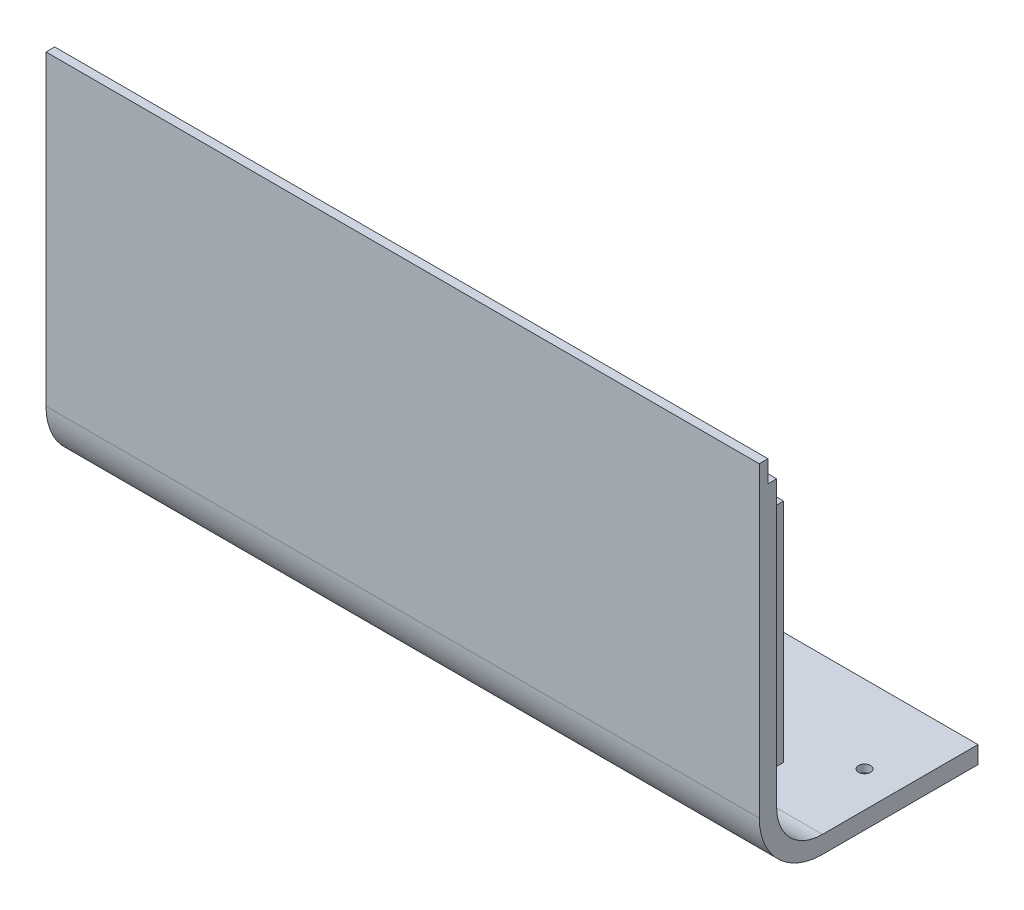
ISO-10303-21;
HEADER;
FILE_DESCRIPTION(('STEP AP214'),'2;1');
FILE_NAME('part.step','',(''),(''),'','','');
FILE_SCHEMA(('AUTOMOTIVE_DESIGN { 1 0 10303 214 1 1 1 1 }'));
ENDSEC;
DATA;
#1=APPLICATION_CONTEXT('core data for automotive mechanical design processes');
#2=APPLICATION_PROTOCOL_DEFINITION('international standard','automotive_design',2000,#1);
#3=PRODUCT_CONTEXT('',#1,'mechanical');
#4=PRODUCT('Part','Part','',(#3));
#5=PRODUCT_RELATED_PRODUCT_CATEGORY('part','',(#4));
#6=PRODUCT_DEFINITION_FORMATION('','',#4);
#7=PRODUCT_DEFINITION_CONTEXT('part definition',#1,'design');
#8=PRODUCT_DEFINITION('design','',#6,#7);
#9=PRODUCT_DEFINITION_SHAPE('','',#8);
#10=(LENGTH_UNIT() NAMED_UNIT(*) SI_UNIT(.MILLI.,.METRE.));
#11=(NAMED_UNIT(*) PLANE_ANGLE_UNIT() SI_UNIT($,.RADIAN.));
#12=(NAMED_UNIT(*) SI_UNIT($,.STERADIAN.) SOLID_ANGLE_UNIT());
#13=UNCERTAINTY_MEASURE_WITH_UNIT(LENGTH_MEASURE(1.E-05),#10,'distance_accuracy_value','');
#14=(GEOMETRIC_REPRESENTATION_CONTEXT(3) GLOBAL_UNCERTAINTY_ASSIGNED_CONTEXT((#13)) GLOBAL_UNIT_ASSIGNED_CONTEXT((#10,
#11,#12)) REPRESENTATION_CONTEXT('',''));
#15=CARTESIAN_POINT('',(0.,0.,0.));
#16=DIRECTION('',(0.,0.,1.));
#17=DIRECTION('',(1.,0.,0.));
#18=AXIS2_PLACEMENT_3D('',#15,#16,#17);
#19=CARTESIAN_POINT('',(131.1,8.40000000000006,0.));
#20=DIRECTION('',(0.,0.,1.));
#21=DIRECTION('',(1.,0.,0.));
#22=AXIS2_PLACEMENT_3D('',#19,#20,#21);
#23=PLANE('',#22);
#24=DIRECTION('',(0.,-1.,0.));
#25=VECTOR('',#24,1.);
#26=CARTESIAN_POINT('',(5.00000000000001,53.5000000000001,0.));
#27=LINE('',#26,#25);
#28=CARTESIAN_POINT('',(5.00000000000001,53.5000000000001,0.));
#29=VERTEX_POINT('',#28);
#30=CARTESIAN_POINT('',(5.,11.9000000000001,0.));
#31=VERTEX_POINT('',#30);
#32=EDGE_CURVE('E224',#29,#31,#27,.T.);
#33=ORIENTED_EDGE('',*,*,#32,.F.);
#34=DIRECTION('',(1.,0.,0.));
#35=VECTOR('',#34,1.);
#36=CARTESIAN_POINT('',(5.00000000000001,53.5000000000001,0.));
#37=LINE('',#36,#35);
#38=CARTESIAN_POINT('',(3.14,53.5000000000001,0.));
#39=VERTEX_POINT('',#38);
#40=EDGE_CURVE('E240',#39,#29,#37,.T.);
#41=ORIENTED_EDGE('',*,*,#40,.F.);
#42=DIRECTION('',(0.,1.,0.));
#43=VECTOR('',#42,1.);
#44=CARTESIAN_POINT('',(3.14000000000001,53.5000000000001,0.));
#45=LINE('',#44,#43);
#46=CARTESIAN_POINT('',(3.14,11.9000000000001,0.));
#47=VERTEX_POINT('',#46);
#48=EDGE_CURVE('E232',#47,#39,#45,.T.);
#49=ORIENTED_EDGE('',*,*,#48,.F.);
#50=DIRECTION('',(-1.,0.,0.));
#51=VECTOR('',#50,1.);
#52=CARTESIAN_POINT('',(5.00000000000001,11.9000000000001,0.));
#53=LINE('',#52,#51);
#54=EDGE_CURVE('E60',#31,#47,#53,.T.);
#55=ORIENTED_EDGE('',*,*,#54,.F.);
#56=EDGE_LOOP('',(#33,#41,#49,#55));
#57=FACE_BOUND('',#56,.T.);
#58=DIRECTION('',(0.,1.,0.));
#59=VECTOR('',#58,1.);
#60=CARTESIAN_POINT('',(126.1,53.5000000000001,0.));
#61=LINE('',#60,#59);
#62=CARTESIAN_POINT('',(126.1,11.9000000000001,0.));
#63=VERTEX_POINT('',#62);
#64=CARTESIAN_POINT('',(126.1,53.5000000000001,0.));
#65=VERTEX_POINT('',#64);
#66=EDGE_CURVE('E254',#63,#65,#61,.T.);
#67=ORIENTED_EDGE('',*,*,#66,.F.);
#68=DIRECTION('',(-1.,0.,0.));
#69=VECTOR('',#68,1.);
#70=CARTESIAN_POINT('',(126.1,11.9000000000001,0.));
#71=LINE('',#70,#69);
#72=CARTESIAN_POINT('',(127.96,11.9000000000001,0.));
#73=VERTEX_POINT('',#72);
#74=EDGE_CURVE('E259',#73,#63,#71,.T.);
#75=ORIENTED_EDGE('',*,*,#74,.F.);
#76=DIRECTION('',(0.,-1.,0.));
#77=VECTOR('',#76,1.);
#78=CARTESIAN_POINT('',(127.96,53.5000000000001,0.));
#79=LINE('',#78,#77);
#80=CARTESIAN_POINT('',(127.96,53.5000000000001,0.));
#81=VERTEX_POINT('',#80);
#82=EDGE_CURVE('E271',#81,#73,#79,.T.);
#83=ORIENTED_EDGE('',*,*,#82,.F.);
#84=DIRECTION('',(1.,0.,0.));
#85=VECTOR('',#84,1.);
#86=CARTESIAN_POINT('',(126.1,53.5000000000001,0.));
#87=LINE('',#86,#85);
#88=EDGE_CURVE('E268',#65,#81,#87,.T.);
#89=ORIENTED_EDGE('',*,*,#88,.F.);
#90=EDGE_LOOP('',(#67,#75,#83,#89));
#91=FACE_BOUND('',#90,.T.);
#92=DIRECTION('',(-1.,0.,0.));
#93=VECTOR('',#92,1.);
#94=CARTESIAN_POINT('',(131.1,60.8,0.));
#95=LINE('',#94,#93);
#96=CARTESIAN_POINT('',(131.1,60.8,0.));
#97=VERTEX_POINT('',#96);
#98=CARTESIAN_POINT('',(0.,60.8,0.));
#99=VERTEX_POINT('',#98);
#100=EDGE_CURVE('E309',#97,#99,#95,.T.);
#101=ORIENTED_EDGE('',*,*,#100,.F.);
#102=DIRECTION('',(0.,1.,0.));
#103=VECTOR('',#102,1.);
#104=CARTESIAN_POINT('',(131.1,8.40000000000006,0.));
#105=LINE('',#104,#103);
#106=CARTESIAN_POINT('',(131.1,8.40000000000006,0.));
#107=VERTEX_POINT('',#106);
#108=EDGE_CURVE('E190',#107,#97,#105,.T.);
#109=ORIENTED_EDGE('',*,*,#108,.F.);
#110=DIRECTION('',(-1.,0.,0.));
#111=VECTOR('',#110,1.);
#112=CARTESIAN_POINT('',(131.1,8.40000000000006,0.));
#113=LINE('',#112,#111);
#114=CARTESIAN_POINT('',(0.,8.40000000000006,0.));
#115=VERTEX_POINT('',#114);
#116=EDGE_CURVE('E203',#107,#115,#113,.T.);
#117=ORIENTED_EDGE('',*,*,#116,.T.);
#118=DIRECTION('',(0.,1.,0.));
#119=VECTOR('',#118,1.);
#120=CARTESIAN_POINT('',(0.,8.40000000000006,0.));
#121=LINE('',#120,#119);
#122=EDGE_CURVE('E200',#115,#99,#121,.T.);
#123=ORIENTED_EDGE('',*,*,#122,.T.);
#124=EDGE_LOOP('',(#101,#109,#117,#123));
#125=FACE_BOUND('',#124,.T.);
#126=ADVANCED_FACE('F37',(#57,#91,#125),#23,.F.);
#127=CARTESIAN_POINT('',(131.1,239.6,3.2));
#128=DIRECTION('',(0.,0.,-1.));
#129=DIRECTION('',(0.,1.,0.));
#130=AXIS2_PLACEMENT_3D('',#127,#128,#129);
#131=PLANE('',#130);
#132=DIRECTION('',(1.,0.,0.));
#133=VECTOR('',#132,1.);
#134=CARTESIAN_POINT('',(0.,64.8,3.19999999999998));
#135=LINE('',#134,#133);
#136=CARTESIAN_POINT('',(0.,64.8,3.19999999999998));
#137=VERTEX_POINT('',#136);
#138=CARTESIAN_POINT('',(131.1,64.8,3.19999999999998));
#139=VERTEX_POINT('',#138);
#140=EDGE_CURVE('E162',#137,#139,#135,.T.);
#141=ORIENTED_EDGE('',*,*,#140,.F.);
#142=DIRECTION('',(0.,-1.,0.));
#143=VECTOR('',#142,1.);
#144=CARTESIAN_POINT('',(0.,239.6,3.2));
#145=LINE('',#144,#143);
#146=CARTESIAN_POINT('',(0.,8.40000000000008,3.19999999999998));
#147=VERTEX_POINT('',#146);
#148=EDGE_CURVE('E173',#137,#147,#145,.T.);
#149=ORIENTED_EDGE('',*,*,#148,.T.);
#150=DIRECTION('',(-1.,0.,0.));
#151=VECTOR('',#150,1.);
#152=CARTESIAN_POINT('',(131.1,8.40000000000008,3.19999999999998));
#153=LINE('',#152,#151);
#154=CARTESIAN_POINT('',(131.1,8.40000000000008,3.19999999999998));
#155=VERTEX_POINT('',#154);
#156=EDGE_CURVE('E45',#155,#147,#153,.T.);
#157=ORIENTED_EDGE('',*,*,#156,.F.);
#158=DIRECTION('',(0.,-1.,0.));
#159=VECTOR('',#158,1.);
#160=CARTESIAN_POINT('',(131.1,239.6,3.2));
#161=LINE('',#160,#159);
#162=EDGE_CURVE('E175',#139,#155,#161,.T.);
#163=ORIENTED_EDGE('',*,*,#162,.F.);
#164=EDGE_LOOP('',(#141,#149,#157,#163));
#165=FACE_BOUND('',#164,.T.);
#166=ADVANCED_FACE('F39',(#165),#131,.F.);
#167=CARTESIAN_POINT('',(131.1,239.6,-8.4));
#168=DIRECTION('',(1.,0.,0.));
#169=DIRECTION('',(0.,0.,-1.));
#170=AXIS2_PLACEMENT_3D('',#167,#168,#169);
#171=PLANE('',#170);
#172=ORIENTED_EDGE('',*,*,#108,.T.);
#173=DIRECTION('',(0.,0.,1.));
#174=VECTOR('',#173,1.);
#175=CARTESIAN_POINT('',(131.1,60.8,0.));
#176=LINE('',#175,#174);
#177=CARTESIAN_POINT('',(131.1,60.8,1.6));
#178=VERTEX_POINT('',#177);
#179=EDGE_CURVE('E168',#97,#178,#176,.T.);
#180=ORIENTED_EDGE('',*,*,#179,.T.);
#181=DIRECTION('',(0.,1.,0.));
#182=VECTOR('',#181,1.);
#183=CARTESIAN_POINT('',(131.1,0.,1.6));
#184=LINE('',#183,#182);
#185=CARTESIAN_POINT('',(131.1,64.8,1.6));
#186=VERTEX_POINT('',#185);
#187=EDGE_CURVE('E423',#178,#186,#184,.T.);
#188=ORIENTED_EDGE('',*,*,#187,.T.);
#189=DIRECTION('',(0.,0.,1.));
#190=VECTOR('',#189,1.);
#191=CARTESIAN_POINT('',(131.1,64.8,0.));
#192=LINE('',#191,#190);
#193=EDGE_CURVE('E421',#186,#139,#192,.T.);
#194=ORIENTED_EDGE('',*,*,#193,.T.);
#195=ORIENTED_EDGE('',*,*,#162,.T.);
#196=CARTESIAN_POINT('',(131.1,8.4,-8.40000000000002));
#197=DIRECTION('',(1.,0.,0.));
#198=DIRECTION('',(0.,0.,-1.));
#199=AXIS2_PLACEMENT_3D('',#196,#197,#198);
#200=CIRCLE('',#199,11.6);
#201=CARTESIAN_POINT('',(131.1,-3.2,-8.40000000000011));
#202=VERTEX_POINT('',#201);
#203=EDGE_CURVE('E290',#155,#202,#200,.T.);
#204=ORIENTED_EDGE('',*,*,#203,.T.);
#205=DIRECTION('',(0.,0.,-1.));
#206=VECTOR('',#205,1.);
#207=CARTESIAN_POINT('',(131.1,-3.2,-37.));
#208=LINE('',#207,#206);
#209=CARTESIAN_POINT('',(131.1,-3.2,-37.));
#210=VERTEX_POINT('',#209);
#211=EDGE_CURVE('E292',#202,#210,#208,.T.);
#212=ORIENTED_EDGE('',*,*,#211,.T.);
#213=DIRECTION('',(0.,1.,0.));
#214=VECTOR('',#213,1.);
#215=CARTESIAN_POINT('',(131.1,0.,-37.));
#216=LINE('',#215,#214);
#217=CARTESIAN_POINT('',(131.1,0.,-37.));
#218=VERTEX_POINT('',#217);
#219=EDGE_CURVE('E294',#210,#218,#216,.T.);
#220=ORIENTED_EDGE('',*,*,#219,.T.);
#221=DIRECTION('',(0.,0.,1.));
#222=VECTOR('',#221,1.);
#223=CARTESIAN_POINT('',(131.1,0.,-8.40000000000006));
#224=LINE('',#223,#222);
#225=CARTESIAN_POINT('',(131.1,0.,-8.40000000000006));
#226=VERTEX_POINT('',#225);
#227=EDGE_CURVE('E296',#218,#226,#224,.T.);
#228=ORIENTED_EDGE('',*,*,#227,.T.);
#229=CARTESIAN_POINT('',(131.1,8.4,-8.4));
#230=DIRECTION('',(-1.,0.,0.));
#231=DIRECTION('',(0.,0.,-1.));
#232=AXIS2_PLACEMENT_3D('',#229,#230,#231);
#233=CIRCLE('',#232,8.4);
#234=EDGE_CURVE('E297',#226,#107,#233,.T.);
#235=ORIENTED_EDGE('',*,*,#234,.T.);
#236=EDGE_LOOP('',(#172,#180,#188,#194,#195,#204,#212,#220,#228,#235));
#237=FACE_BOUND('',#236,.T.);
#238=ADVANCED_FACE('F304',(#237),#171,.T.);
#239=CARTESIAN_POINT('',(0.,239.6,-8.4));
#240=DIRECTION('',(1.,0.,0.));
#241=DIRECTION('',(0.,0.,-1.));
#242=AXIS2_PLACEMENT_3D('',#239,#240,#241);
#243=PLANE('',#242);
#244=DIRECTION('',(0.,0.,1.));
#245=VECTOR('',#244,1.);
#246=CARTESIAN_POINT('',(0.,60.8,-8.39999999999997));
#247=LINE('',#246,#245);
#248=CARTESIAN_POINT('',(0.,60.8,1.6));
#249=VERTEX_POINT('',#248);
#250=EDGE_CURVE('E11',#99,#249,#247,.T.);
#251=ORIENTED_EDGE('',*,*,#250,.F.);
#252=ORIENTED_EDGE('',*,*,#122,.F.);
#253=CARTESIAN_POINT('',(0.,8.4,-8.4));
#254=DIRECTION('',(-1.,0.,0.));
#255=DIRECTION('',(0.,0.,-1.));
#256=AXIS2_PLACEMENT_3D('',#253,#254,#255);
#257=CIRCLE('',#256,8.4);
#258=CARTESIAN_POINT('',(0.,0.,-8.40000000000006));
#259=VERTEX_POINT('',#258);
#260=EDGE_CURVE('E198',#259,#115,#257,.T.);
#261=ORIENTED_EDGE('',*,*,#260,.F.);
#262=DIRECTION('',(0.,0.,1.));
#263=VECTOR('',#262,1.);
#264=CARTESIAN_POINT('',(0.,0.,-8.40000000000006));
#265=LINE('',#264,#263);
#266=CARTESIAN_POINT('',(0.,0.,-37.));
#267=VERTEX_POINT('',#266);
#268=EDGE_CURVE('E196',#267,#259,#265,.T.);
#269=ORIENTED_EDGE('',*,*,#268,.F.);
#270=DIRECTION('',(0.,1.,0.));
#271=VECTOR('',#270,1.);
#272=CARTESIAN_POINT('',(0.,0.,-37.));
#273=LINE('',#272,#271);
#274=CARTESIAN_POINT('',(0.,-3.2,-37.));
#275=VERTEX_POINT('',#274);
#276=EDGE_CURVE('E194',#275,#267,#273,.T.);
#277=ORIENTED_EDGE('',*,*,#276,.F.);
#278=DIRECTION('',(0.,0.,-1.));
#279=VECTOR('',#278,1.);
#280=CARTESIAN_POINT('',(0.,-3.2,-37.));
#281=LINE('',#280,#279);
#282=CARTESIAN_POINT('',(0.,-3.2,-8.40000000000011));
#283=VERTEX_POINT('',#282);
#284=EDGE_CURVE('E184',#283,#275,#281,.T.);
#285=ORIENTED_EDGE('',*,*,#284,.F.);
#286=CARTESIAN_POINT('',(0.,8.4,-8.40000000000002));
#287=DIRECTION('',(1.,0.,0.));
#288=DIRECTION('',(0.,0.,-1.));
#289=AXIS2_PLACEMENT_3D('',#286,#287,#288);
#290=CIRCLE('',#289,11.6);
#291=EDGE_CURVE('E181',#147,#283,#290,.T.);
#292=ORIENTED_EDGE('',*,*,#291,.F.);
#293=ORIENTED_EDGE('',*,*,#148,.F.);
#294=DIRECTION('',(0.,0.,1.));
#295=VECTOR('',#294,1.);
#296=CARTESIAN_POINT('',(0.,64.8,0.));
#297=LINE('',#296,#295);
#298=CARTESIAN_POINT('',(0.,64.8,1.6));
#299=VERTEX_POINT('',#298);
#300=EDGE_CURVE('E159',#299,#137,#297,.T.);
#301=ORIENTED_EDGE('',*,*,#300,.F.);
#302=DIRECTION('',(0.,1.,0.));
#303=VECTOR('',#302,1.);
#304=CARTESIAN_POINT('',(0.,0.,1.6));
#305=LINE('',#304,#303);
#306=EDGE_CURVE('E167',#249,#299,#305,.T.);
#307=ORIENTED_EDGE('',*,*,#306,.F.);
#308=EDGE_LOOP('',(#251,#252,#261,#269,#277,#285,#292,#293,#301,#307));
#309=FACE_BOUND('',#308,.T.);
#310=ADVANCED_FACE('F179',(#309),#243,.F.);
#311=CARTESIAN_POINT('',(124.55,-3.19999999999998,-22.6999999999995));
#312=DIRECTION('',(0.,1.,0.));
#313=DIRECTION('',(0.,0.,1.));
#314=AXIS2_PLACEMENT_3D('',#311,#312,#313);
#315=CYLINDRICAL_SURFACE('',#314,1.10000000000002);
#316=CARTESIAN_POINT('',(124.55,0.,-22.6999999999995));
#317=DIRECTION('',(0.,-1.,0.));
#318=DIRECTION('',(0.,0.,-1.));
#319=AXIS2_PLACEMENT_3D('',#316,#317,#318);
#320=CIRCLE('',#319,1.10000000000002);
#321=CARTESIAN_POINT('',(124.55,0.,-23.7999999999995));
#322=VERTEX_POINT('',#321);
#323=EDGE_CURVE('E187',#322,#322,#320,.T.);
#324=ORIENTED_EDGE('',*,*,#323,.F.);
#325=EDGE_LOOP('',(#324));
#326=FACE_BOUND('',#325,.T.);
#327=CARTESIAN_POINT('',(124.55,-1.4,-22.6999999999995));
#328=DIRECTION('',(0.,-1.,0.));
#329=DIRECTION('',(0.,0.,-1.));
#330=AXIS2_PLACEMENT_3D('',#327,#328,#329);
#331=CIRCLE('',#330,1.10000000000002);
#332=CARTESIAN_POINT('',(124.55,-1.4,-23.7999999999995));
#333=VERTEX_POINT('',#332);
#334=EDGE_CURVE('E221',#333,#333,#331,.F.);
#335=ORIENTED_EDGE('',*,*,#334,.F.);
#336=EDGE_LOOP('',(#335));
#337=FACE_BOUND('',#336,.T.);
#338=ADVANCED_FACE('F381',(#326,#337),#315,.F.);
#339=CARTESIAN_POINT('',(6.55,-3.19999999999998,-22.6999999999995));
#340=DIRECTION('',(0.,1.,0.));
#341=DIRECTION('',(0.,0.,1.));
#342=AXIS2_PLACEMENT_3D('',#339,#340,#341);
#343=CYLINDRICAL_SURFACE('',#342,1.1);
#344=CARTESIAN_POINT('',(6.55,0.,-22.6999999999995));
#345=DIRECTION('',(0.,-1.,0.));
#346=DIRECTION('',(0.,0.,-1.));
#347=AXIS2_PLACEMENT_3D('',#344,#345,#346);
#348=CIRCLE('',#347,1.1);
#349=CARTESIAN_POINT('',(6.55,0.,-23.7999999999995));
#350=VERTEX_POINT('',#349);
#351=EDGE_CURVE('E182',#350,#350,#348,.T.);
#352=ORIENTED_EDGE('',*,*,#351,.F.);
#353=EDGE_LOOP('',(#352));
#354=FACE_BOUND('',#353,.T.);
#355=CARTESIAN_POINT('',(6.55,-1.4,-22.6999999999995));
#356=DIRECTION('',(0.,-1.,0.));
#357=DIRECTION('',(0.,0.,-1.));
#358=AXIS2_PLACEMENT_3D('',#355,#356,#357);
#359=CIRCLE('',#358,1.1);
#360=CARTESIAN_POINT('',(6.55,-1.4,-23.7999999999995));
#361=VERTEX_POINT('',#360);
#362=EDGE_CURVE('E219',#361,#361,#359,.F.);
#363=ORIENTED_EDGE('',*,*,#362,.F.);
#364=EDGE_LOOP('',(#363));
#365=FACE_BOUND('',#364,.T.);
#366=ADVANCED_FACE('F377',(#354,#365),#343,.F.);
#367=CARTESIAN_POINT('',(131.1,8.4,-8.40000000000002));
#368=DIRECTION('',(-1.,0.,0.));
#369=DIRECTION('',(0.,0.,1.));
#370=AXIS2_PLACEMENT_3D('',#367,#368,#369);
#371=CYLINDRICAL_SURFACE('',#370,11.6);
#372=ORIENTED_EDGE('',*,*,#291,.T.);
#373=DIRECTION('',(-1.,0.,0.));
#374=VECTOR('',#373,1.);
#375=CARTESIAN_POINT('',(131.1,-3.2,-8.40000000000011));
#376=LINE('',#375,#374);
#377=EDGE_CURVE('E215',#202,#283,#376,.T.);
#378=ORIENTED_EDGE('',*,*,#377,.F.);
#379=ORIENTED_EDGE('',*,*,#203,.F.);
#380=ORIENTED_EDGE('',*,*,#156,.T.);
#381=EDGE_LOOP('',(#372,#378,#379,#380));
#382=FACE_BOUND('',#381,.T.);
#383=ADVANCED_FACE('F380',(#382),#371,.T.);
#384=CARTESIAN_POINT('',(131.1,-3.2,-37.));
#385=DIRECTION('',(0.,1.,0.));
#386=DIRECTION('',(0.,0.,1.));
#387=AXIS2_PLACEMENT_3D('',#384,#385,#386);
#388=PLANE('',#387);
#389=CARTESIAN_POINT('',(124.55,-3.2,-22.7000000000002));
#390=DIRECTION('',(0.,-1.,0.));
#391=DIRECTION('',(0.,0.,-1.));
#392=AXIS2_PLACEMENT_3D('',#389,#390,#391);
#393=CIRCLE('',#392,2.27);
#394=CARTESIAN_POINT('',(124.55,-3.2,-24.9700000000002));
#395=VERTEX_POINT('',#394);
#396=EDGE_CURVE('E322',#395,#395,#393,.T.);
#397=ORIENTED_EDGE('',*,*,#396,.F.);
#398=EDGE_LOOP('',(#397));
#399=FACE_BOUND('',#398,.T.);
#400=CARTESIAN_POINT('',(6.55,-3.2,-22.7000000000003));
#401=DIRECTION('',(0.,-1.,0.));
#402=DIRECTION('',(0.,0.,-1.));
#403=AXIS2_PLACEMENT_3D('',#400,#401,#402);
#404=CIRCLE('',#403,2.27);
#405=CARTESIAN_POINT('',(6.55,-3.2,-24.9700000000003));
#406=VERTEX_POINT('',#405);
#407=EDGE_CURVE('E311',#406,#406,#404,.T.);
#408=ORIENTED_EDGE('',*,*,#407,.F.);
#409=EDGE_LOOP('',(#408));
#410=FACE_BOUND('',#409,.T.);
#411=ORIENTED_EDGE('',*,*,#284,.T.);
#412=DIRECTION('',(-1.,0.,0.));
#413=VECTOR('',#412,1.);
#414=CARTESIAN_POINT('',(131.1,-3.2,-37.));
#415=LINE('',#414,#413);
#416=EDGE_CURVE('E212',#210,#275,#415,.T.);
#417=ORIENTED_EDGE('',*,*,#416,.F.);
#418=ORIENTED_EDGE('',*,*,#211,.F.);
#419=ORIENTED_EDGE('',*,*,#377,.T.);
#420=EDGE_LOOP('',(#411,#417,#418,#419));
#421=FACE_BOUND('',#420,.T.);
#422=ADVANCED_FACE('F400',(#399,#410,#421),#388,.F.);
#423=CARTESIAN_POINT('',(131.1,0.,-37.));
#424=DIRECTION('',(0.,0.,1.));
#425=DIRECTION('',(1.,0.,0.));
#426=AXIS2_PLACEMENT_3D('',#423,#424,#425);
#427=PLANE('',#426);
#428=ORIENTED_EDGE('',*,*,#276,.T.);
#429=DIRECTION('',(-1.,0.,0.));
#430=VECTOR('',#429,1.);
#431=CARTESIAN_POINT('',(131.1,0.,-37.));
#432=LINE('',#431,#430);
#433=EDGE_CURVE('E209',#218,#267,#432,.T.);
#434=ORIENTED_EDGE('',*,*,#433,.F.);
#435=ORIENTED_EDGE('',*,*,#219,.F.);
#436=ORIENTED_EDGE('',*,*,#416,.T.);
#437=EDGE_LOOP('',(#428,#434,#435,#436));
#438=FACE_BOUND('',#437,.T.);
#439=ADVANCED_FACE('F396',(#438),#427,.F.);
#440=CARTESIAN_POINT('',(131.1,0.,-8.40000000000006));
#441=DIRECTION('',(0.,-1.,0.));
#442=DIRECTION('',(0.,0.,-1.));
#443=AXIS2_PLACEMENT_3D('',#440,#441,#442);
#444=PLANE('',#443);
#445=ORIENTED_EDGE('',*,*,#351,.T.);
#446=EDGE_LOOP('',(#445));
#447=FACE_BOUND('',#446,.T.);
#448=ORIENTED_EDGE('',*,*,#323,.T.);
#449=EDGE_LOOP('',(#448));
#450=FACE_BOUND('',#449,.T.);
#451=ORIENTED_EDGE('',*,*,#268,.T.);
#452=DIRECTION('',(-1.,0.,0.));
#453=VECTOR('',#452,1.);
#454=CARTESIAN_POINT('',(131.1,0.,-8.40000000000006));
#455=LINE('',#454,#453);
#456=EDGE_CURVE('E206',#226,#259,#455,.T.);
#457=ORIENTED_EDGE('',*,*,#456,.F.);
#458=ORIENTED_EDGE('',*,*,#227,.F.);
#459=ORIENTED_EDGE('',*,*,#433,.T.);
#460=EDGE_LOOP('',(#451,#457,#458,#459));
#461=FACE_BOUND('',#460,.T.);
#462=ADVANCED_FACE('F392',(#447,#450,#461),#444,.F.);
#463=CARTESIAN_POINT('',(131.1,8.4,-8.4));
#464=DIRECTION('',(-1.,0.,0.));
#465=DIRECTION('',(0.,0.,1.));
#466=AXIS2_PLACEMENT_3D('',#463,#464,#465);
#467=CYLINDRICAL_SURFACE('',#466,8.4);
#468=ORIENTED_EDGE('',*,*,#260,.T.);
#469=ORIENTED_EDGE('',*,*,#116,.F.);
#470=ORIENTED_EDGE('',*,*,#234,.F.);
#471=ORIENTED_EDGE('',*,*,#456,.T.);
#472=EDGE_LOOP('',(#468,#469,#470,#471));
#473=FACE_BOUND('',#472,.T.);
#474=ADVANCED_FACE('F373',(#473),#467,.F.);
#475=CARTESIAN_POINT('',(126.1,53.5000000000001,-4.4));
#476=DIRECTION('',(1.,0.,0.));
#477=DIRECTION('',(0.,0.,-1.));
#478=AXIS2_PLACEMENT_3D('',#475,#476,#477);
#479=PLANE('',#478);
#480=ORIENTED_EDGE('',*,*,#66,.T.);
#481=DIRECTION('',(0.,0.,1.));
#482=VECTOR('',#481,1.);
#483=CARTESIAN_POINT('',(126.1,53.5000000000001,-4.4));
#484=LINE('',#483,#482);
#485=CARTESIAN_POINT('',(126.1,53.5000000000001,-4.4));
#486=VERTEX_POINT('',#485);
#487=EDGE_CURVE('E284',#486,#65,#484,.T.);
#488=ORIENTED_EDGE('',*,*,#487,.F.);
#489=DIRECTION('',(0.,1.,0.));
#490=VECTOR('',#489,1.);
#491=CARTESIAN_POINT('',(126.1,53.5000000000001,-4.4));
#492=LINE('',#491,#490);
#493=CARTESIAN_POINT('',(126.1,11.9000000000001,-4.4));
#494=VERTEX_POINT('',#493);
#495=EDGE_CURVE('E255',#494,#486,#492,.T.);
#496=ORIENTED_EDGE('',*,*,#495,.F.);
#497=DIRECTION('',(0.,0.,1.));
#498=VECTOR('',#497,1.);
#499=CARTESIAN_POINT('',(126.1,11.9000000000001,-4.4));
#500=LINE('',#499,#498);
#501=EDGE_CURVE('E265',#494,#63,#500,.T.);
#502=ORIENTED_EDGE('',*,*,#501,.T.);
#503=EDGE_LOOP('',(#480,#488,#496,#502));
#504=FACE_BOUND('',#503,.T.);
#505=ADVANCED_FACE('F357',(#504),#479,.F.);
#506=CARTESIAN_POINT('',(126.1,53.5000000000001,-4.4));
#507=DIRECTION('',(0.,-1.,0.));
#508=DIRECTION('',(0.,0.,-1.));
#509=AXIS2_PLACEMENT_3D('',#506,#507,#508);
#510=PLANE('',#509);
#511=ORIENTED_EDGE('',*,*,#88,.T.);
#512=DIRECTION('',(0.,0.,1.));
#513=VECTOR('',#512,1.);
#514=CARTESIAN_POINT('',(127.96,53.5000000000001,-4.4));
#515=LINE('',#514,#513);
#516=CARTESIAN_POINT('',(127.96,53.5000000000001,-4.4));
#517=VERTEX_POINT('',#516);
#518=EDGE_CURVE('E281',#517,#81,#515,.T.);
#519=ORIENTED_EDGE('',*,*,#518,.F.);
#520=DIRECTION('',(1.,0.,0.));
#521=VECTOR('',#520,1.);
#522=CARTESIAN_POINT('',(126.1,53.5000000000001,-4.4));
#523=LINE('',#522,#521);
#524=EDGE_CURVE('E258',#486,#517,#523,.T.);
#525=ORIENTED_EDGE('',*,*,#524,.F.);
#526=ORIENTED_EDGE('',*,*,#487,.T.);
#527=EDGE_LOOP('',(#511,#519,#525,#526));
#528=FACE_BOUND('',#527,.T.);
#529=ADVANCED_FACE('F365',(#528),#510,.F.);
#530=CARTESIAN_POINT('',(127.96,53.5000000000001,-4.4));
#531=DIRECTION('',(-1.,0.,0.));
#532=DIRECTION('',(0.,0.,1.));
#533=AXIS2_PLACEMENT_3D('',#530,#531,#532);
#534=PLANE('',#533);
#535=ORIENTED_EDGE('',*,*,#82,.T.);
#536=DIRECTION('',(0.,0.,1.));
#537=VECTOR('',#536,1.);
#538=CARTESIAN_POINT('',(127.96,11.9000000000001,-4.4));
#539=LINE('',#538,#537);
#540=CARTESIAN_POINT('',(127.96,11.9000000000001,-4.4));
#541=VERTEX_POINT('',#540);
#542=EDGE_CURVE('E278',#541,#73,#539,.T.);
#543=ORIENTED_EDGE('',*,*,#542,.F.);
#544=DIRECTION('',(0.,-1.,0.));
#545=VECTOR('',#544,1.);
#546=CARTESIAN_POINT('',(127.96,53.5000000000001,-4.4));
#547=LINE('',#546,#545);
#548=EDGE_CURVE('E261',#517,#541,#547,.T.);
#549=ORIENTED_EDGE('',*,*,#548,.F.);
#550=ORIENTED_EDGE('',*,*,#518,.T.);
#551=EDGE_LOOP('',(#535,#543,#549,#550));
#552=FACE_BOUND('',#551,.T.);
#553=ADVANCED_FACE('F363',(#552),#534,.F.);
#554=CARTESIAN_POINT('',(126.1,11.9000000000001,-4.4));
#555=DIRECTION('',(0.,1.,0.));
#556=DIRECTION('',(0.,0.,1.));
#557=AXIS2_PLACEMENT_3D('',#554,#555,#556);
#558=PLANE('',#557);
#559=ORIENTED_EDGE('',*,*,#74,.T.);
#560=ORIENTED_EDGE('',*,*,#501,.F.);
#561=DIRECTION('',(-1.,0.,0.));
#562=VECTOR('',#561,1.);
#563=CARTESIAN_POINT('',(126.1,11.9000000000001,-4.4));
#564=LINE('',#563,#562);
#565=EDGE_CURVE('E263',#541,#494,#564,.T.);
#566=ORIENTED_EDGE('',*,*,#565,.F.);
#567=ORIENTED_EDGE('',*,*,#542,.T.);
#568=EDGE_LOOP('',(#559,#560,#566,#567));
#569=FACE_BOUND('',#568,.T.);
#570=ADVANCED_FACE('F353',(#569),#558,.F.);
#571=CARTESIAN_POINT('',(0.,0.,-4.4));
#572=DIRECTION('',(0.,0.,1.));
#573=DIRECTION('',(1.,0.,0.));
#574=AXIS2_PLACEMENT_3D('',#571,#572,#573);
#575=PLANE('',#574);
#576=ORIENTED_EDGE('',*,*,#495,.T.);
#577=ORIENTED_EDGE('',*,*,#524,.T.);
#578=ORIENTED_EDGE('',*,*,#548,.T.);
#579=ORIENTED_EDGE('',*,*,#565,.T.);
#580=EDGE_LOOP('',(#576,#577,#578,#579));
#581=FACE_BOUND('',#580,.T.);
#582=ADVANCED_FACE('F359',(#581),#575,.F.);
#583=CARTESIAN_POINT('',(5.00000000000001,53.5000000000001,-4.4));
#584=DIRECTION('',(-1.,0.,0.));
#585=DIRECTION('',(0.,-1.,0.));
#586=AXIS2_PLACEMENT_3D('',#583,#584,#585);
#587=PLANE('',#586);
#588=ORIENTED_EDGE('',*,*,#32,.T.);
#589=DIRECTION('',(0.,0.,1.));
#590=VECTOR('',#589,1.);
#591=CARTESIAN_POINT('',(5.00000000000001,11.9000000000001,-4.4));
#592=LINE('',#591,#590);
#593=CARTESIAN_POINT('',(5.00000000000001,11.9000000000001,-4.4));
#594=VERTEX_POINT('',#593);
#595=EDGE_CURVE('E252',#594,#31,#592,.T.);
#596=ORIENTED_EDGE('',*,*,#595,.F.);
#597=DIRECTION('',(0.,-1.,0.));
#598=VECTOR('',#597,1.);
#599=CARTESIAN_POINT('',(5.00000000000001,53.5000000000001,-4.4));
#600=LINE('',#599,#598);
#601=CARTESIAN_POINT('',(5.00000000000001,53.5000000000001,-4.4));
#602=VERTEX_POINT('',#601);
#603=EDGE_CURVE('E243',#602,#594,#600,.T.);
#604=ORIENTED_EDGE('',*,*,#603,.F.);
#605=DIRECTION('',(0.,0.,1.));
#606=VECTOR('',#605,1.);
#607=CARTESIAN_POINT('',(5.00000000000001,53.5000000000001,-4.4));
#608=LINE('',#607,#606);
#609=EDGE_CURVE('E244',#602,#29,#608,.T.);
#610=ORIENTED_EDGE('',*,*,#609,.T.);
#611=EDGE_LOOP('',(#588,#596,#604,#610));
#612=FACE_BOUND('',#611,.T.);
#613=ADVANCED_FACE('F340',(#612),#587,.F.);
#614=CARTESIAN_POINT('',(5.00000000000001,11.9000000000001,-4.4));
#615=DIRECTION('',(0.,1.,0.));
#616=DIRECTION('',(0.,0.,1.));
#617=AXIS2_PLACEMENT_3D('',#614,#615,#616);
#618=PLANE('',#617);
#619=ORIENTED_EDGE('',*,*,#54,.T.);
#620=DIRECTION('',(0.,0.,1.));
#621=VECTOR('',#620,1.);
#622=CARTESIAN_POINT('',(3.14000000000001,11.9000000000001,-4.4));
#623=LINE('',#622,#621);
#624=CARTESIAN_POINT('',(3.14000000000001,11.9000000000001,-4.4));
#625=VERTEX_POINT('',#624);
#626=EDGE_CURVE('E249',#625,#47,#623,.T.);
#627=ORIENTED_EDGE('',*,*,#626,.F.);
#628=DIRECTION('',(-1.,0.,0.));
#629=VECTOR('',#628,1.);
#630=CARTESIAN_POINT('',(5.00000000000001,11.9000000000001,-4.4));
#631=LINE('',#630,#629);
#632=EDGE_CURVE('E329',#594,#625,#631,.T.);
#633=ORIENTED_EDGE('',*,*,#632,.F.);
#634=ORIENTED_EDGE('',*,*,#595,.T.);
#635=EDGE_LOOP('',(#619,#627,#633,#634));
#636=FACE_BOUND('',#635,.T.);
#637=ADVANCED_FACE('F342',(#636),#618,.F.);
#638=CARTESIAN_POINT('',(3.14000000000001,53.5000000000001,-4.4));
#639=DIRECTION('',(1.,0.,0.));
#640=DIRECTION('',(0.,1.,0.));
#641=AXIS2_PLACEMENT_3D('',#638,#639,#640);
#642=PLANE('',#641);
#643=ORIENTED_EDGE('',*,*,#48,.T.);
#644=DIRECTION('',(0.,0.,1.));
#645=VECTOR('',#644,1.);
#646=CARTESIAN_POINT('',(3.14000000000001,53.5000000000001,-4.4));
#647=LINE('',#646,#645);
#648=CARTESIAN_POINT('',(3.14000000000001,53.5000000000001,-4.4));
#649=VERTEX_POINT('',#648);
#650=EDGE_CURVE('E246',#649,#39,#647,.T.);
#651=ORIENTED_EDGE('',*,*,#650,.F.);
#652=DIRECTION('',(0.,1.,0.));
#653=VECTOR('',#652,1.);
#654=CARTESIAN_POINT('',(3.14000000000001,53.5000000000001,-4.4));
#655=LINE('',#654,#653);
#656=EDGE_CURVE('E330',#625,#649,#655,.T.);
#657=ORIENTED_EDGE('',*,*,#656,.F.);
#658=ORIENTED_EDGE('',*,*,#626,.T.);
#659=EDGE_LOOP('',(#643,#651,#657,#658));
#660=FACE_BOUND('',#659,.T.);
#661=ADVANCED_FACE('F345',(#660),#642,.F.);
#662=CARTESIAN_POINT('',(5.00000000000001,53.5000000000001,-4.4));
#663=DIRECTION('',(0.,-1.,0.));
#664=DIRECTION('',(0.,0.,-1.));
#665=AXIS2_PLACEMENT_3D('',#662,#663,#664);
#666=PLANE('',#665);
#667=ORIENTED_EDGE('',*,*,#40,.T.);
#668=ORIENTED_EDGE('',*,*,#609,.F.);
#669=DIRECTION('',(1.,0.,0.));
#670=VECTOR('',#669,1.);
#671=CARTESIAN_POINT('',(5.00000000000001,53.5000000000001,-4.4));
#672=LINE('',#671,#670);
#673=EDGE_CURVE('E235',#649,#602,#672,.T.);
#674=ORIENTED_EDGE('',*,*,#673,.F.);
#675=ORIENTED_EDGE('',*,*,#650,.T.);
#676=EDGE_LOOP('',(#667,#668,#674,#675));
#677=FACE_BOUND('',#676,.T.);
#678=ADVANCED_FACE('F339',(#677),#666,.F.);
#679=CARTESIAN_POINT('',(0.,0.,-4.4));
#680=DIRECTION('',(0.,0.,-1.));
#681=DIRECTION('',(-1.,0.,0.));
#682=AXIS2_PLACEMENT_3D('',#679,#680,#681);
#683=PLANE('',#682);
#684=ORIENTED_EDGE('',*,*,#603,.T.);
#685=ORIENTED_EDGE('',*,*,#632,.T.);
#686=ORIENTED_EDGE('',*,*,#656,.T.);
#687=ORIENTED_EDGE('',*,*,#673,.T.);
#688=EDGE_LOOP('',(#684,#685,#686,#687));
#689=FACE_BOUND('',#688,.T.);
#690=ADVANCED_FACE('F336',(#689),#683,.T.);
#691=CARTESIAN_POINT('',(6.55,-1.4,-22.7000000000003));
#692=DIRECTION('',(0.,-1.,0.));
#693=DIRECTION('',(0.,0.,-1.));
#694=AXIS2_PLACEMENT_3D('',#691,#692,#693);
#695=PLANE('',#694);
#696=CARTESIAN_POINT('',(6.55,-1.4,-22.7000000000003));
#697=DIRECTION('',(0.,-1.,0.));
#698=DIRECTION('',(0.,0.,-1.));
#699=AXIS2_PLACEMENT_3D('',#696,#697,#698);
#700=CIRCLE('',#699,2.27);
#701=CARTESIAN_POINT('',(6.55,-1.4,-24.9700000000003));
#702=VERTEX_POINT('',#701);
#703=EDGE_CURVE('E315',#702,#702,#700,.T.);
#704=ORIENTED_EDGE('',*,*,#703,.T.);
#705=EDGE_LOOP('',(#704));
#706=FACE_BOUND('',#705,.T.);
#707=ORIENTED_EDGE('',*,*,#362,.T.);
#708=EDGE_LOOP('',(#707));
#709=FACE_BOUND('',#708,.T.);
#710=ADVANCED_FACE('F450',(#706,#709),#695,.T.);
#711=CARTESIAN_POINT('',(6.55,-1.4,-22.7000000000003));
#712=DIRECTION('',(0.,-1.,0.));
#713=DIRECTION('',(0.,0.,-1.));
#714=AXIS2_PLACEMENT_3D('',#711,#712,#713);
#715=CYLINDRICAL_SURFACE('',#714,2.27);
#716=ORIENTED_EDGE('',*,*,#703,.F.);
#717=EDGE_LOOP('',(#716));
#718=FACE_BOUND('',#717,.T.);
#719=ORIENTED_EDGE('',*,*,#407,.T.);
#720=EDGE_LOOP('',(#719));
#721=FACE_BOUND('',#720,.T.);
#722=ADVANCED_FACE('F447',(#718,#721),#715,.F.);
#723=CARTESIAN_POINT('',(124.55,-1.4,-22.7000000000002));
#724=DIRECTION('',(0.,-1.,0.));
#725=DIRECTION('',(0.,0.,-1.));
#726=AXIS2_PLACEMENT_3D('',#723,#724,#725);
#727=PLANE('',#726);
#728=CARTESIAN_POINT('',(124.55,-1.4,-22.7000000000002));
#729=DIRECTION('',(0.,-1.,0.));
#730=DIRECTION('',(0.,0.,-1.));
#731=AXIS2_PLACEMENT_3D('',#728,#729,#730);
#732=CIRCLE('',#731,2.27);
#733=CARTESIAN_POINT('',(124.55,-1.4,-24.9700000000002));
#734=VERTEX_POINT('',#733);
#735=EDGE_CURVE('E222',#734,#734,#732,.T.);
#736=ORIENTED_EDGE('',*,*,#735,.T.);
#737=EDGE_LOOP('',(#736));
#738=FACE_BOUND('',#737,.T.);
#739=ORIENTED_EDGE('',*,*,#334,.T.);
#740=EDGE_LOOP('',(#739));
#741=FACE_BOUND('',#740,.T.);
#742=ADVANCED_FACE('F440',(#738,#741),#727,.T.);
#743=CARTESIAN_POINT('',(124.55,-1.4,-22.7000000000002));
#744=DIRECTION('',(0.,-1.,0.));
#745=DIRECTION('',(0.,0.,-1.));
#746=AXIS2_PLACEMENT_3D('',#743,#744,#745);
#747=CYLINDRICAL_SURFACE('',#746,2.27);
#748=ORIENTED_EDGE('',*,*,#735,.F.);
#749=EDGE_LOOP('',(#748));
#750=FACE_BOUND('',#749,.T.);
#751=ORIENTED_EDGE('',*,*,#396,.T.);
#752=EDGE_LOOP('',(#751));
#753=FACE_BOUND('',#752,.T.);
#754=ADVANCED_FACE('F433',(#750,#753),#747,.F.);
#755=CARTESIAN_POINT('',(0.,60.8,0.));
#756=DIRECTION('',(0.,1.,0.));
#757=DIRECTION('',(0.,0.,1.));
#758=AXIS2_PLACEMENT_3D('',#755,#756,#757);
#759=PLANE('',#758);
#760=ORIENTED_EDGE('',*,*,#100,.T.);
#761=ORIENTED_EDGE('',*,*,#250,.T.);
#762=DIRECTION('',(1.,0.,0.));
#763=VECTOR('',#762,1.);
#764=CARTESIAN_POINT('',(0.,60.8,1.6));
#765=LINE('',#764,#763);
#766=EDGE_CURVE('E312',#249,#178,#765,.T.);
#767=ORIENTED_EDGE('',*,*,#766,.T.);
#768=ORIENTED_EDGE('',*,*,#179,.F.);
#769=EDGE_LOOP('',(#760,#761,#767,#768));
#770=FACE_BOUND('',#769,.T.);
#771=ADVANCED_FACE('F431',(#770),#759,.T.);
#772=CARTESIAN_POINT('',(0.,0.,1.6));
#773=DIRECTION('',(0.,0.,-1.));
#774=DIRECTION('',(-1.,0.,0.));
#775=AXIS2_PLACEMENT_3D('',#772,#773,#774);
#776=PLANE('',#775);
#777=ORIENTED_EDGE('',*,*,#187,.F.);
#778=ORIENTED_EDGE('',*,*,#766,.F.);
#779=ORIENTED_EDGE('',*,*,#306,.T.);
#780=DIRECTION('',(1.,0.,0.));
#781=VECTOR('',#780,1.);
#782=CARTESIAN_POINT('',(0.,64.8,1.6));
#783=LINE('',#782,#781);
#784=EDGE_CURVE('E52',#299,#186,#783,.T.);
#785=ORIENTED_EDGE('',*,*,#784,.T.);
#786=EDGE_LOOP('',(#777,#778,#779,#785));
#787=FACE_BOUND('',#786,.T.);
#788=ADVANCED_FACE('F429',(#787),#776,.T.);
#789=CARTESIAN_POINT('',(0.,64.8,0.));
#790=DIRECTION('',(0.,1.,0.));
#791=DIRECTION('',(0.,0.,1.));
#792=AXIS2_PLACEMENT_3D('',#789,#790,#791);
#793=PLANE('',#792);
#794=ORIENTED_EDGE('',*,*,#193,.F.);
#795=ORIENTED_EDGE('',*,*,#784,.F.);
#796=ORIENTED_EDGE('',*,*,#300,.T.);
#797=ORIENTED_EDGE('',*,*,#140,.T.);
#798=EDGE_LOOP('',(#794,#795,#796,#797));
#799=FACE_BOUND('',#798,.T.);
#800=ADVANCED_FACE('F161',(#799),#793,.T.);
#801=CLOSED_SHELL('',(#126,#166,#238,#310,#338,#366,#383,#422,#439,#462,#474,#505,#529,#553,
#570,#582,#613,#637,#661,#678,#690,#710,#722,#742,#754,#771,#788,#800));
#802=MANIFOLD_SOLID_BREP('B2',#801);
#803=ADVANCED_BREP_SHAPE_REPRESENTATION('',(#18,#802),#14);
#804=SHAPE_DEFINITION_REPRESENTATION(#9,#803);
ENDSEC;
END-ISO-10303-21;
